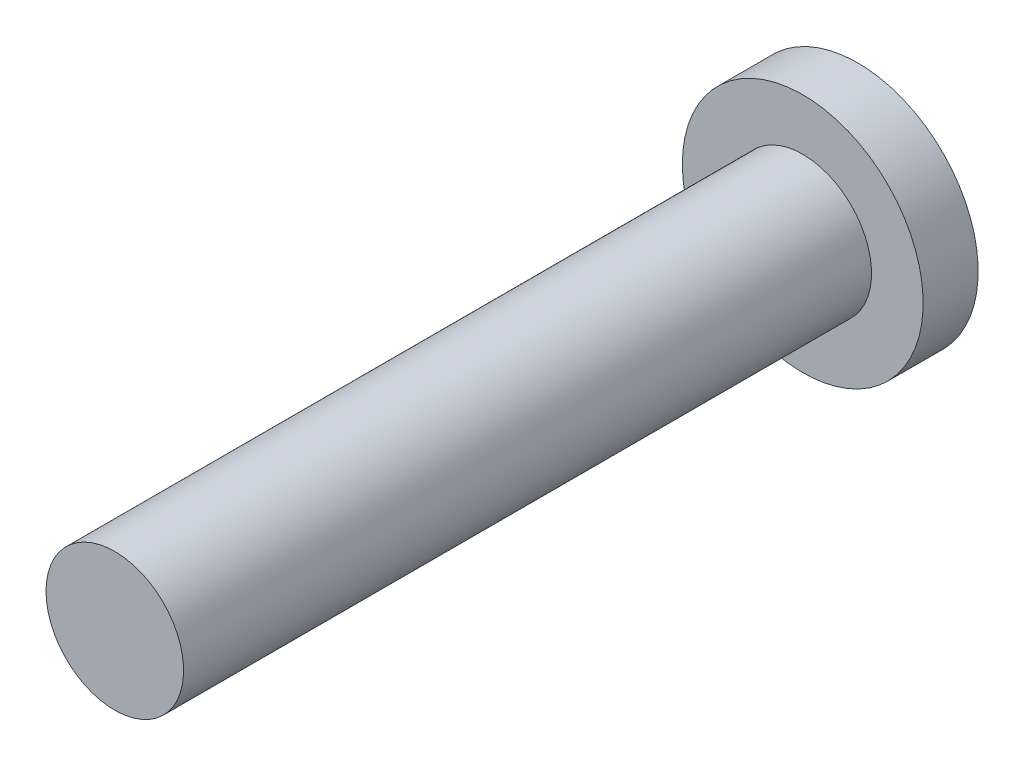
ISO-10303-21;
HEADER;
FILE_DESCRIPTION(('STEP AP214'),'2;1');
FILE_NAME('part.step','',(''),(''),'','','');
FILE_SCHEMA(('AUTOMOTIVE_DESIGN { 1 0 10303 214 1 1 1 1 }'));
ENDSEC;
DATA;
#1=APPLICATION_CONTEXT('core data for automotive mechanical design processes');
#2=APPLICATION_PROTOCOL_DEFINITION('international standard','automotive_design',2000,#1);
#3=PRODUCT_CONTEXT('',#1,'mechanical');
#4=PRODUCT('Part','Part','',(#3));
#5=PRODUCT_RELATED_PRODUCT_CATEGORY('part','',(#4));
#6=PRODUCT_DEFINITION_FORMATION('','',#4);
#7=PRODUCT_DEFINITION_CONTEXT('part definition',#1,'design');
#8=PRODUCT_DEFINITION('design','',#6,#7);
#9=PRODUCT_DEFINITION_SHAPE('','',#8);
#10=(LENGTH_UNIT() NAMED_UNIT(*) SI_UNIT(.MILLI.,.METRE.));
#11=(NAMED_UNIT(*) PLANE_ANGLE_UNIT() SI_UNIT($,.RADIAN.));
#12=(NAMED_UNIT(*) SI_UNIT($,.STERADIAN.) SOLID_ANGLE_UNIT());
#13=UNCERTAINTY_MEASURE_WITH_UNIT(LENGTH_MEASURE(1.E-05),#10,'distance_accuracy_value','');
#14=(GEOMETRIC_REPRESENTATION_CONTEXT(3) GLOBAL_UNCERTAINTY_ASSIGNED_CONTEXT((#13)) GLOBAL_UNIT_ASSIGNED_CONTEXT((#10,
#11,#12)) REPRESENTATION_CONTEXT('',''));
#15=CARTESIAN_POINT('',(0.,0.,0.));
#16=DIRECTION('',(0.,0.,1.));
#17=DIRECTION('',(1.,0.,0.));
#18=AXIS2_PLACEMENT_3D('',#15,#16,#17);
#19=CARTESIAN_POINT('',(0.,0.,0.));
#20=DIRECTION('',(0.,0.,-1.));
#21=DIRECTION('',(-1.,0.,0.));
#22=AXIS2_PLACEMENT_3D('',#19,#20,#21);
#23=PLANE('',#22);
#24=CARTESIAN_POINT('',(0.,0.,0.));
#25=DIRECTION('',(0.,0.,-1.));
#26=DIRECTION('',(-1.,0.,0.));
#27=AXIS2_PLACEMENT_3D('',#24,#25,#26);
#28=CIRCLE('',#27,1.);
#29=CARTESIAN_POINT('',(-1.,0.,0.));
#30=VERTEX_POINT('',#29);
#31=EDGE_CURVE('E10',#30,#30,#28,.T.);
#32=ORIENTED_EDGE('',*,*,#31,.F.);
#33=EDGE_LOOP('',(#32));
#34=FACE_BOUND('',#33,.T.);
#35=ADVANCED_FACE('F37',(#34),#23,.F.);
#36=CARTESIAN_POINT('',(0.,0.,-10.8));
#37=DIRECTION('',(0.,0.,-1.));
#38=DIRECTION('',(-1.,0.,0.));
#39=AXIS2_PLACEMENT_3D('',#36,#37,#38);
#40=CYLINDRICAL_SURFACE('',#39,1.);
#41=CARTESIAN_POINT('',(0.,0.,-10.));
#42=DIRECTION('',(0.,0.,-1.));
#43=DIRECTION('',(-1.,0.,0.));
#44=AXIS2_PLACEMENT_3D('',#41,#42,#43);
#45=CIRCLE('',#44,1.);
#46=CARTESIAN_POINT('',(-1.,0.,-10.));
#47=VERTEX_POINT('',#46);
#48=EDGE_CURVE('E44',#47,#47,#45,.T.);
#49=ORIENTED_EDGE('',*,*,#48,.F.);
#50=EDGE_LOOP('',(#49));
#51=FACE_BOUND('',#50,.T.);
#52=ORIENTED_EDGE('',*,*,#31,.T.);
#53=EDGE_LOOP('',(#52));
#54=FACE_BOUND('',#53,.T.);
#55=ADVANCED_FACE('F71',(#51,#54),#40,.T.);
#56=CARTESIAN_POINT('',(1.,0.,-10.));
#57=DIRECTION('',(0.,0.,-1.));
#58=DIRECTION('',(-1.,0.,0.));
#59=AXIS2_PLACEMENT_3D('',#56,#57,#58);
#60=PLANE('',#59);
#61=CARTESIAN_POINT('',(0.,0.,-10.));
#62=DIRECTION('',(0.,0.,-1.));
#63=DIRECTION('',(-1.,0.,0.));
#64=AXIS2_PLACEMENT_3D('',#61,#62,#63);
#65=CIRCLE('',#64,1.75);
#66=CARTESIAN_POINT('',(-1.75,0.,-10.));
#67=VERTEX_POINT('',#66);
#68=EDGE_CURVE('E49',#67,#67,#65,.T.);
#69=ORIENTED_EDGE('',*,*,#68,.F.);
#70=EDGE_LOOP('',(#69));
#71=FACE_BOUND('',#70,.T.);
#72=ORIENTED_EDGE('',*,*,#48,.T.);
#73=EDGE_LOOP('',(#72));
#74=FACE_BOUND('',#73,.T.);
#75=ADVANCED_FACE('F66',(#71,#74),#60,.F.);
#76=CARTESIAN_POINT('',(0.,0.,-10.8));
#77=DIRECTION('',(0.,0.,-1.));
#78=DIRECTION('',(-1.,0.,0.));
#79=AXIS2_PLACEMENT_3D('',#76,#77,#78);
#80=CYLINDRICAL_SURFACE('',#79,1.75000000000002);
#81=CARTESIAN_POINT('',(0.,0.,-10.8));
#82=DIRECTION('',(0.,0.,-1.));
#83=DIRECTION('',(-1.,0.,0.));
#84=AXIS2_PLACEMENT_3D('',#81,#82,#83);
#85=CIRCLE('',#84,1.75000000000004);
#86=CARTESIAN_POINT('',(-1.75000000000004,0.,-10.8));
#87=VERTEX_POINT('',#86);
#88=EDGE_CURVE('E54',#87,#87,#85,.T.);
#89=ORIENTED_EDGE('',*,*,#88,.F.);
#90=EDGE_LOOP('',(#89));
#91=FACE_BOUND('',#90,.T.);
#92=ORIENTED_EDGE('',*,*,#68,.T.);
#93=EDGE_LOOP('',(#92));
#94=FACE_BOUND('',#93,.T.);
#95=ADVANCED_FACE('F63',(#91,#94),#80,.T.);
#96=CARTESIAN_POINT('',(1.75000000000004,0.,-10.8));
#97=DIRECTION('',(0.,0.,1.));
#98=DIRECTION('',(1.,0.,0.));
#99=AXIS2_PLACEMENT_3D('',#96,#97,#98);
#100=PLANE('',#99);
#101=ORIENTED_EDGE('',*,*,#88,.T.);
#102=EDGE_LOOP('',(#101));
#103=FACE_BOUND('',#102,.T.);
#104=ADVANCED_FACE('F61',(#103),#100,.F.);
#105=CLOSED_SHELL('',(#35,#55,#75,#95,#104));
#106=MANIFOLD_SOLID_BREP('B2',#105);
#107=ADVANCED_BREP_SHAPE_REPRESENTATION('',(#18,#106),#14);
#108=SHAPE_DEFINITION_REPRESENTATION(#9,#107);
ENDSEC;
END-ISO-10303-21;
